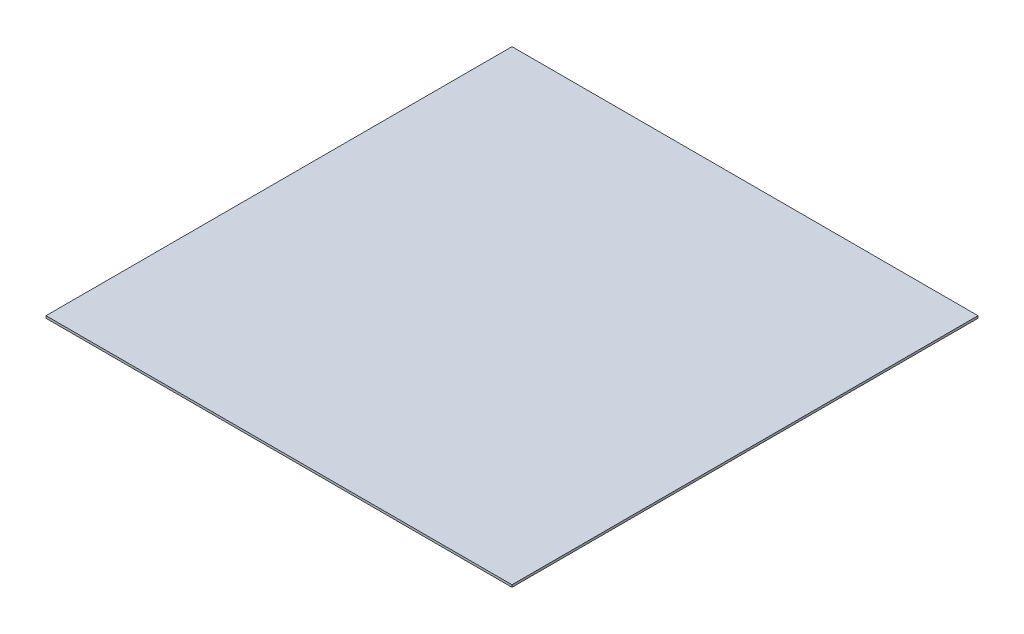
ISO-10303-21;
HEADER;
FILE_DESCRIPTION(('STEP AP214'),'2;1');
FILE_NAME('part.step','',(''),(''),'','','');
FILE_SCHEMA(('AUTOMOTIVE_DESIGN { 1 0 10303 214 1 1 1 1 }'));
ENDSEC;
DATA;
#1=APPLICATION_CONTEXT('core data for automotive mechanical design processes');
#2=APPLICATION_PROTOCOL_DEFINITION('international standard','automotive_design',2000,#1);
#3=PRODUCT_CONTEXT('',#1,'mechanical');
#4=PRODUCT('Part','Part','',(#3));
#5=PRODUCT_RELATED_PRODUCT_CATEGORY('part','',(#4));
#6=PRODUCT_DEFINITION_FORMATION('','',#4);
#7=PRODUCT_DEFINITION_CONTEXT('part definition',#1,'design');
#8=PRODUCT_DEFINITION('design','',#6,#7);
#9=PRODUCT_DEFINITION_SHAPE('','',#8);
#10=(LENGTH_UNIT() NAMED_UNIT(*) SI_UNIT(.MILLI.,.METRE.));
#11=(NAMED_UNIT(*) PLANE_ANGLE_UNIT() SI_UNIT($,.RADIAN.));
#12=(NAMED_UNIT(*) SI_UNIT($,.STERADIAN.) SOLID_ANGLE_UNIT());
#13=UNCERTAINTY_MEASURE_WITH_UNIT(LENGTH_MEASURE(1.E-05),#10,'distance_accuracy_value','');
#14=(GEOMETRIC_REPRESENTATION_CONTEXT(3) GLOBAL_UNCERTAINTY_ASSIGNED_CONTEXT((#13)) GLOBAL_UNIT_ASSIGNED_CONTEXT((#10,
#11,#12)) REPRESENTATION_CONTEXT('',''));
#15=CARTESIAN_POINT('',(0.,0.,0.));
#16=DIRECTION('',(0.,0.,1.));
#17=DIRECTION('',(1.,0.,0.));
#18=AXIS2_PLACEMENT_3D('',#15,#16,#17);
#19=CARTESIAN_POINT('',(41.,0.4,41.));
#20=DIRECTION('',(-1.,0.,0.));
#21=DIRECTION('',(0.,0.,1.));
#22=AXIS2_PLACEMENT_3D('',#19,#20,#21);
#23=PLANE('',#22);
#24=DIRECTION('',(0.,0.,-1.));
#25=VECTOR('',#24,1.);
#26=CARTESIAN_POINT('',(41.,0.,41.));
#27=LINE('',#26,#25);
#28=CARTESIAN_POINT('',(41.,0.,41.));
#29=VERTEX_POINT('',#28);
#30=CARTESIAN_POINT('',(41.,0.,-41.));
#31=VERTEX_POINT('',#30);
#32=EDGE_CURVE('E109',#29,#31,#27,.T.);
#33=ORIENTED_EDGE('',*,*,#32,.T.);
#34=DIRECTION('',(0.,-1.,0.));
#35=VECTOR('',#34,1.);
#36=CARTESIAN_POINT('',(41.,0.4,-41.));
#37=LINE('',#36,#35);
#38=CARTESIAN_POINT('',(41.,0.4,-41.));
#39=VERTEX_POINT('',#38);
#40=EDGE_CURVE('E11',#39,#31,#37,.T.);
#41=ORIENTED_EDGE('',*,*,#40,.F.);
#42=DIRECTION('',(0.,0.,-1.));
#43=VECTOR('',#42,1.);
#44=CARTESIAN_POINT('',(41.,0.4,41.));
#45=LINE('',#44,#43);
#46=CARTESIAN_POINT('',(41.,0.4,41.));
#47=VERTEX_POINT('',#46);
#48=EDGE_CURVE('E93',#47,#39,#45,.T.);
#49=ORIENTED_EDGE('',*,*,#48,.F.);
#50=DIRECTION('',(0.,-1.,0.));
#51=VECTOR('',#50,1.);
#52=CARTESIAN_POINT('',(41.,0.4,41.));
#53=LINE('',#52,#51);
#54=EDGE_CURVE('E105',#47,#29,#53,.T.);
#55=ORIENTED_EDGE('',*,*,#54,.T.);
#56=EDGE_LOOP('',(#33,#41,#49,#55));
#57=FACE_BOUND('',#56,.T.);
#58=ADVANCED_FACE('F41',(#57),#23,.F.);
#59=CARTESIAN_POINT('',(-41.,0.4,-41.));
#60=DIRECTION('',(0.,0.,1.));
#61=DIRECTION('',(1.,0.,0.));
#62=AXIS2_PLACEMENT_3D('',#59,#60,#61);
#63=PLANE('',#62);
#64=DIRECTION('',(-1.,0.,0.));
#65=VECTOR('',#64,1.);
#66=CARTESIAN_POINT('',(-41.,0.,-41.));
#67=LINE('',#66,#65);
#68=CARTESIAN_POINT('',(-41.,0.,-41.));
#69=VERTEX_POINT('',#68);
#70=EDGE_CURVE('E98',#31,#69,#67,.T.);
#71=ORIENTED_EDGE('',*,*,#70,.T.);
#72=DIRECTION('',(0.,-1.,0.));
#73=VECTOR('',#72,1.);
#74=CARTESIAN_POINT('',(-41.,0.4,-41.));
#75=LINE('',#74,#73);
#76=CARTESIAN_POINT('',(-41.,0.4,-41.));
#77=VERTEX_POINT('',#76);
#78=EDGE_CURVE('E50',#77,#69,#75,.T.);
#79=ORIENTED_EDGE('',*,*,#78,.F.);
#80=DIRECTION('',(-1.,0.,0.));
#81=VECTOR('',#80,1.);
#82=CARTESIAN_POINT('',(-41.,0.4,-41.));
#83=LINE('',#82,#81);
#84=EDGE_CURVE('E88',#39,#77,#83,.T.);
#85=ORIENTED_EDGE('',*,*,#84,.F.);
#86=ORIENTED_EDGE('',*,*,#40,.T.);
#87=EDGE_LOOP('',(#71,#79,#85,#86));
#88=FACE_BOUND('',#87,.T.);
#89=ADVANCED_FACE('F97',(#88),#63,.F.);
#90=CARTESIAN_POINT('',(-41.,0.4,41.));
#91=DIRECTION('',(1.,0.,0.));
#92=DIRECTION('',(0.,0.,-1.));
#93=AXIS2_PLACEMENT_3D('',#90,#91,#92);
#94=PLANE('',#93);
#95=DIRECTION('',(0.,0.,1.));
#96=VECTOR('',#95,1.);
#97=CARTESIAN_POINT('',(-41.,0.,41.));
#98=LINE('',#97,#96);
#99=CARTESIAN_POINT('',(-41.,0.,41.));
#100=VERTEX_POINT('',#99);
#101=EDGE_CURVE('E75',#69,#100,#98,.T.);
#102=ORIENTED_EDGE('',*,*,#101,.T.);
#103=DIRECTION('',(0.,-1.,0.));
#104=VECTOR('',#103,1.);
#105=CARTESIAN_POINT('',(-41.,0.4,41.));
#106=LINE('',#105,#104);
#107=CARTESIAN_POINT('',(-41.,0.4,41.));
#108=VERTEX_POINT('',#107);
#109=EDGE_CURVE('E100',#108,#100,#106,.T.);
#110=ORIENTED_EDGE('',*,*,#109,.F.);
#111=DIRECTION('',(0.,0.,1.));
#112=VECTOR('',#111,1.);
#113=CARTESIAN_POINT('',(-41.,0.4,41.));
#114=LINE('',#113,#112);
#115=EDGE_CURVE('E91',#77,#108,#114,.T.);
#116=ORIENTED_EDGE('',*,*,#115,.F.);
#117=ORIENTED_EDGE('',*,*,#78,.T.);
#118=EDGE_LOOP('',(#102,#110,#116,#117));
#119=FACE_BOUND('',#118,.T.);
#120=ADVANCED_FACE('F101',(#119),#94,.F.);
#121=CARTESIAN_POINT('',(-41.,0.4,41.));
#122=DIRECTION('',(0.,0.,-1.));
#123=DIRECTION('',(-1.,0.,0.));
#124=AXIS2_PLACEMENT_3D('',#121,#122,#123);
#125=PLANE('',#124);
#126=DIRECTION('',(1.,0.,0.));
#127=VECTOR('',#126,1.);
#128=CARTESIAN_POINT('',(-41.,0.,41.));
#129=LINE('',#128,#127);
#130=EDGE_CURVE('E81',#100,#29,#129,.T.);
#131=ORIENTED_EDGE('',*,*,#130,.T.);
#132=ORIENTED_EDGE('',*,*,#54,.F.);
#133=DIRECTION('',(1.,0.,0.));
#134=VECTOR('',#133,1.);
#135=CARTESIAN_POINT('',(-41.,0.4,41.));
#136=LINE('',#135,#134);
#137=EDGE_CURVE('E58',#108,#47,#136,.T.);
#138=ORIENTED_EDGE('',*,*,#137,.F.);
#139=ORIENTED_EDGE('',*,*,#109,.T.);
#140=EDGE_LOOP('',(#131,#132,#138,#139));
#141=FACE_BOUND('',#140,.T.);
#142=ADVANCED_FACE('F122',(#141),#125,.F.);
#143=CARTESIAN_POINT('',(0.,0.4,0.));
#144=DIRECTION('',(0.,-1.,0.));
#145=DIRECTION('',(0.,0.,-1.));
#146=AXIS2_PLACEMENT_3D('',#143,#144,#145);
#147=PLANE('',#146);
#148=ORIENTED_EDGE('',*,*,#48,.T.);
#149=ORIENTED_EDGE('',*,*,#84,.T.);
#150=ORIENTED_EDGE('',*,*,#115,.T.);
#151=ORIENTED_EDGE('',*,*,#137,.T.);
#152=EDGE_LOOP('',(#148,#149,#150,#151));
#153=FACE_BOUND('',#152,.T.);
#154=ADVANCED_FACE('F89',(#153),#147,.F.);
#155=CARTESIAN_POINT('',(0.,0.,0.));
#156=DIRECTION('',(0.,-1.,0.));
#157=DIRECTION('',(0.,0.,-1.));
#158=AXIS2_PLACEMENT_3D('',#155,#156,#157);
#159=PLANE('',#158);
#160=ORIENTED_EDGE('',*,*,#32,.F.);
#161=ORIENTED_EDGE('',*,*,#130,.F.);
#162=ORIENTED_EDGE('',*,*,#101,.F.);
#163=ORIENTED_EDGE('',*,*,#70,.F.);
#164=EDGE_LOOP('',(#160,#161,#162,#163));
#165=FACE_BOUND('',#164,.T.);
#166=ADVANCED_FACE('F125',(#165),#159,.T.);
#167=CLOSED_SHELL('',(#58,#89,#120,#142,#154,#166));
#168=MANIFOLD_SOLID_BREP('B2',#167);
#169=ADVANCED_BREP_SHAPE_REPRESENTATION('',(#18,#168),#14);
#170=SHAPE_DEFINITION_REPRESENTATION(#9,#169);
ENDSEC;
END-ISO-10303-21;
